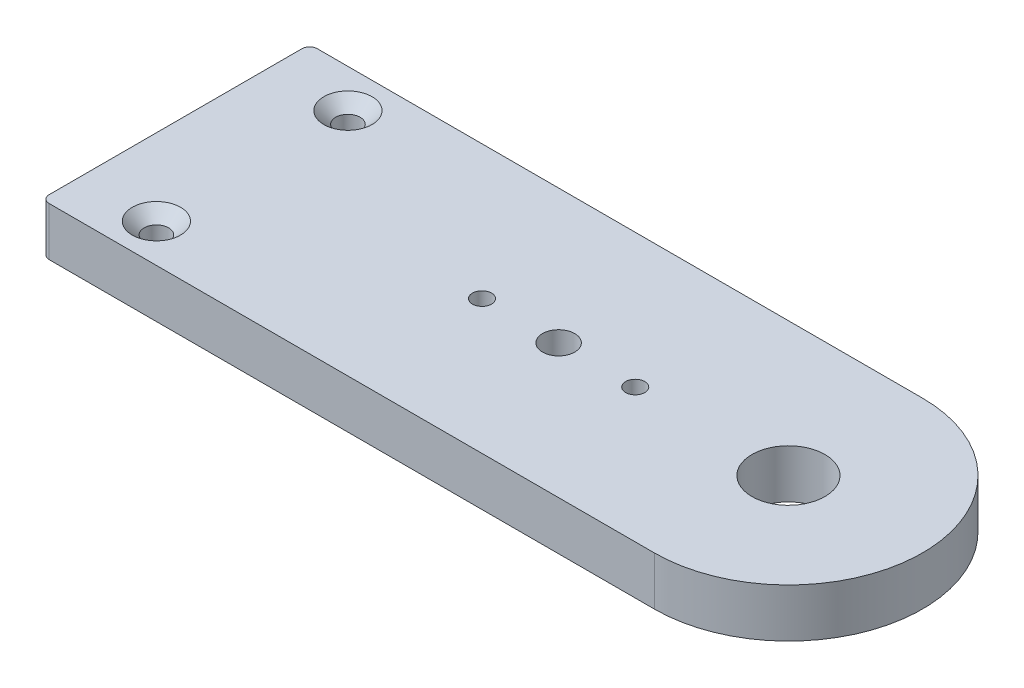
ISO-10303-21;
HEADER;
FILE_DESCRIPTION(('STEP AP214'),'2;1');
FILE_NAME('part.step','',(''),(''),'','','');
FILE_SCHEMA(('AUTOMOTIVE_DESIGN { 1 0 10303 214 1 1 1 1 }'));
ENDSEC;
DATA;
#1=APPLICATION_CONTEXT('core data for automotive mechanical design processes');
#2=APPLICATION_PROTOCOL_DEFINITION('international standard','automotive_design',2000,#1);
#3=PRODUCT_CONTEXT('',#1,'mechanical');
#4=PRODUCT('Part','Part','',(#3));
#5=PRODUCT_RELATED_PRODUCT_CATEGORY('part','',(#4));
#6=PRODUCT_DEFINITION_FORMATION('','',#4);
#7=PRODUCT_DEFINITION_CONTEXT('part definition',#1,'design');
#8=PRODUCT_DEFINITION('design','',#6,#7);
#9=PRODUCT_DEFINITION_SHAPE('','',#8);
#10=(LENGTH_UNIT() NAMED_UNIT(*) SI_UNIT(.MILLI.,.METRE.));
#11=(NAMED_UNIT(*) PLANE_ANGLE_UNIT() SI_UNIT($,.RADIAN.));
#12=(NAMED_UNIT(*) SI_UNIT($,.STERADIAN.) SOLID_ANGLE_UNIT());
#13=UNCERTAINTY_MEASURE_WITH_UNIT(LENGTH_MEASURE(1.E-05),#10,'distance_accuracy_value','');
#14=(GEOMETRIC_REPRESENTATION_CONTEXT(3) GLOBAL_UNCERTAINTY_ASSIGNED_CONTEXT((#13)) GLOBAL_UNIT_ASSIGNED_CONTEXT((#10,
#11,#12)) REPRESENTATION_CONTEXT('',''));
#15=CARTESIAN_POINT('',(0.,0.,0.));
#16=DIRECTION('',(0.,0.,1.));
#17=DIRECTION('',(1.,0.,0.));
#18=AXIS2_PLACEMENT_3D('',#15,#16,#17);
#19=CARTESIAN_POINT('',(70.,0.,0.));
#20=DIRECTION('',(0.,-1.,0.));
#21=DIRECTION('',(0.,0.,-1.));
#22=AXIS2_PLACEMENT_3D('',#19,#20,#21);
#23=PLANE('',#22);
#24=CARTESIAN_POINT('',(40.,0.,0.));
#25=DIRECTION('',(0.,1.,0.));
#26=DIRECTION('',(0.,0.,1.));
#27=AXIS2_PLACEMENT_3D('',#24,#25,#26);
#28=CIRCLE('',#27,2.09999999999999);
#29=CARTESIAN_POINT('',(40.,0.,2.09999999999999));
#30=VERTEX_POINT('',#29);
#31=EDGE_CURVE('E269',#30,#30,#28,.T.);
#32=ORIENTED_EDGE('',*,*,#31,.F.);
#33=EDGE_LOOP('',(#32));
#34=FACE_BOUND('',#33,.T.);
#35=CARTESIAN_POINT('',(30.,0.,0.));
#36=DIRECTION('',(0.,1.,0.));
#37=DIRECTION('',(0.,0.,1.));
#38=AXIS2_PLACEMENT_3D('',#35,#36,#37);
#39=CIRCLE('',#38,1.25);
#40=CARTESIAN_POINT('',(30.,0.,1.25));
#41=VERTEX_POINT('',#40);
#42=EDGE_CURVE('E263',#41,#41,#39,.T.);
#43=ORIENTED_EDGE('',*,*,#42,.F.);
#44=EDGE_LOOP('',(#43));
#45=FACE_BOUND('',#44,.T.);
#46=CARTESIAN_POINT('',(50.,0.,0.));
#47=DIRECTION('',(0.,1.,0.));
#48=DIRECTION('',(0.,0.,1.));
#49=AXIS2_PLACEMENT_3D('',#46,#47,#48);
#50=CIRCLE('',#49,1.25);
#51=CARTESIAN_POINT('',(50.,0.,1.25));
#52=VERTEX_POINT('',#51);
#53=EDGE_CURVE('E257',#52,#52,#50,.T.);
#54=ORIENTED_EDGE('',*,*,#53,.F.);
#55=EDGE_LOOP('',(#54));
#56=FACE_BOUND('',#55,.T.);
#57=CARTESIAN_POINT('',(70.,0.,0.));
#58=DIRECTION('',(0.,1.,0.));
#59=DIRECTION('',(0.,0.,1.));
#60=AXIS2_PLACEMENT_3D('',#57,#58,#59);
#61=CIRCLE('',#60,4.7625);
#62=CARTESIAN_POINT('',(70.,0.,4.7625));
#63=VERTEX_POINT('',#62);
#64=EDGE_CURVE('E230',#63,#63,#61,.T.);
#65=ORIENTED_EDGE('',*,*,#64,.F.);
#66=EDGE_LOOP('',(#65));
#67=FACE_BOUND('',#66,.T.);
#68=DIRECTION('',(-1.,0.,0.));
#69=VECTOR('',#68,1.);
#70=CARTESIAN_POINT('',(-10.,0.,-17.5));
#71=LINE('',#70,#69);
#72=CARTESIAN_POINT('',(70.,0.,-17.5));
#73=VERTEX_POINT('',#72);
#74=CARTESIAN_POINT('',(-9.,0.,-17.5));
#75=VERTEX_POINT('',#74);
#76=EDGE_CURVE('E128',#73,#75,#71,.T.);
#77=ORIENTED_EDGE('',*,*,#76,.T.);
#78=CARTESIAN_POINT('',(-9.,0.,-16.5));
#79=DIRECTION('',(0.,-1.,0.));
#80=DIRECTION('',(0.,0.,-1.));
#81=AXIS2_PLACEMENT_3D('',#78,#79,#80);
#82=CIRCLE('',#81,1.);
#83=CARTESIAN_POINT('',(-10.,0.,-16.5));
#84=VERTEX_POINT('',#83);
#85=EDGE_CURVE('E144',#75,#84,#82,.F.);
#86=ORIENTED_EDGE('',*,*,#85,.T.);
#87=DIRECTION('',(0.,0.,1.));
#88=VECTOR('',#87,1.);
#89=CARTESIAN_POINT('',(-10.,0.,-17.5));
#90=LINE('',#89,#88);
#91=CARTESIAN_POINT('',(-10.,0.,16.5));
#92=VERTEX_POINT('',#91);
#93=EDGE_CURVE('E99',#84,#92,#90,.T.);
#94=ORIENTED_EDGE('',*,*,#93,.T.);
#95=CARTESIAN_POINT('',(-9.,0.,16.5));
#96=DIRECTION('',(0.,-1.,0.));
#97=DIRECTION('',(0.,0.,-1.));
#98=AXIS2_PLACEMENT_3D('',#95,#96,#97);
#99=CIRCLE('',#98,1.);
#100=CARTESIAN_POINT('',(-9.,0.,17.5));
#101=VERTEX_POINT('',#100);
#102=EDGE_CURVE('E141',#92,#101,#99,.F.);
#103=ORIENTED_EDGE('',*,*,#102,.T.);
#104=DIRECTION('',(1.,0.,0.));
#105=VECTOR('',#104,1.);
#106=CARTESIAN_POINT('',(-10.,0.,17.5));
#107=LINE('',#106,#105);
#108=CARTESIAN_POINT('',(70.,0.,17.5));
#109=VERTEX_POINT('',#108);
#110=EDGE_CURVE('E122',#101,#109,#107,.T.);
#111=ORIENTED_EDGE('',*,*,#110,.T.);
#112=CARTESIAN_POINT('',(70.,0.,0.));
#113=DIRECTION('',(0.,1.,0.));
#114=DIRECTION('',(0.,0.,-1.));
#115=AXIS2_PLACEMENT_3D('',#112,#113,#114);
#116=CIRCLE('',#115,17.5);
#117=EDGE_CURVE('E105',#109,#73,#116,.T.);
#118=ORIENTED_EDGE('',*,*,#117,.T.);
#119=EDGE_LOOP('',(#77,#86,#94,#103,#111,#118));
#120=FACE_BOUND('',#119,.T.);
#121=CARTESIAN_POINT('',(0.,0.,12.5));
#122=DIRECTION('',(0.,1.,0.));
#123=DIRECTION('',(0.,0.,1.));
#124=AXIS2_PLACEMENT_3D('',#121,#122,#123);
#125=CIRCLE('',#124,3.15);
#126=CARTESIAN_POINT('',(0.,0.,15.65));
#127=VERTEX_POINT('',#126);
#128=EDGE_CURVE('E241',#127,#127,#125,.T.);
#129=ORIENTED_EDGE('',*,*,#128,.F.);
#130=EDGE_LOOP('',(#129));
#131=FACE_BOUND('',#130,.T.);
#132=CARTESIAN_POINT('',(0.,0.,-12.5));
#133=DIRECTION('',(0.,1.,0.));
#134=DIRECTION('',(0.,0.,1.));
#135=AXIS2_PLACEMENT_3D('',#132,#133,#134);
#136=CIRCLE('',#135,3.15);
#137=CARTESIAN_POINT('',(0.,0.,-9.35));
#138=VERTEX_POINT('',#137);
#139=EDGE_CURVE('E251',#138,#138,#136,.T.);
#140=ORIENTED_EDGE('',*,*,#139,.F.);
#141=EDGE_LOOP('',(#140));
#142=FACE_BOUND('',#141,.T.);
#143=ADVANCED_FACE('F39',(#34,#45,#56,#67,#120,#131,#142),#23,.F.);
#144=CARTESIAN_POINT('',(-10.,-6.35,17.5));
#145=DIRECTION('',(0.,0.,1.));
#146=DIRECTION('',(1.,0.,0.));
#147=AXIS2_PLACEMENT_3D('',#144,#145,#146);
#148=PLANE('',#147);
#149=ORIENTED_EDGE('',*,*,#110,.F.);
#150=DIRECTION('',(0.,1.,0.));
#151=VECTOR('',#150,1.);
#152=CARTESIAN_POINT('',(-9.,-6.35,17.5));
#153=LINE('',#152,#151);
#154=CARTESIAN_POINT('',(-9.,-6.35,17.5));
#155=VERTEX_POINT('',#154);
#156=EDGE_CURVE('E11',#101,#155,#153,.F.);
#157=ORIENTED_EDGE('',*,*,#156,.T.);
#158=DIRECTION('',(1.,0.,0.));
#159=VECTOR('',#158,1.);
#160=CARTESIAN_POINT('',(-10.,-6.35,17.5));
#161=LINE('',#160,#159);
#162=CARTESIAN_POINT('',(70.,-6.35,17.5));
#163=VERTEX_POINT('',#162);
#164=EDGE_CURVE('E91',#155,#163,#161,.T.);
#165=ORIENTED_EDGE('',*,*,#164,.T.);
#166=DIRECTION('',(0.,1.,0.));
#167=VECTOR('',#166,1.);
#168=CARTESIAN_POINT('',(70.,-6.35,17.5));
#169=LINE('',#168,#167);
#170=EDGE_CURVE('E94',#163,#109,#169,.T.);
#171=ORIENTED_EDGE('',*,*,#170,.T.);
#172=EDGE_LOOP('',(#149,#157,#165,#171));
#173=FACE_BOUND('',#172,.T.);
#174=ADVANCED_FACE('F93',(#173),#148,.T.);
#175=CARTESIAN_POINT('',(-10.,-6.35,-17.5));
#176=DIRECTION('',(-1.,0.,0.));
#177=DIRECTION('',(0.,0.,1.));
#178=AXIS2_PLACEMENT_3D('',#175,#176,#177);
#179=PLANE('',#178);
#180=ORIENTED_EDGE('',*,*,#93,.F.);
#181=DIRECTION('',(0.,1.,0.));
#182=VECTOR('',#181,1.);
#183=CARTESIAN_POINT('',(-10.,-6.35,-16.5));
#184=LINE('',#183,#182);
#185=CARTESIAN_POINT('',(-10.,-6.35,-16.5));
#186=VERTEX_POINT('',#185);
#187=EDGE_CURVE('E151',#84,#186,#184,.F.);
#188=ORIENTED_EDGE('',*,*,#187,.T.);
#189=DIRECTION('',(0.,0.,1.));
#190=VECTOR('',#189,1.);
#191=CARTESIAN_POINT('',(-10.,-6.35,-17.5));
#192=LINE('',#191,#190);
#193=CARTESIAN_POINT('',(-10.,-6.35,16.5));
#194=VERTEX_POINT('',#193);
#195=EDGE_CURVE('E108',#186,#194,#192,.T.);
#196=ORIENTED_EDGE('',*,*,#195,.T.);
#197=DIRECTION('',(0.,1.,0.));
#198=VECTOR('',#197,1.);
#199=CARTESIAN_POINT('',(-10.,-6.35,16.5));
#200=LINE('',#199,#198);
#201=EDGE_CURVE('E147',#194,#92,#200,.T.);
#202=ORIENTED_EDGE('',*,*,#201,.T.);
#203=EDGE_LOOP('',(#180,#188,#196,#202));
#204=FACE_BOUND('',#203,.T.);
#205=ADVANCED_FACE('F168',(#204),#179,.T.);
#206=CARTESIAN_POINT('',(-10.,-6.35,-17.5));
#207=DIRECTION('',(0.,0.,-1.));
#208=DIRECTION('',(-1.,0.,0.));
#209=AXIS2_PLACEMENT_3D('',#206,#207,#208);
#210=PLANE('',#209);
#211=DIRECTION('',(-1.,0.,0.));
#212=VECTOR('',#211,1.);
#213=CARTESIAN_POINT('',(-10.,-6.35,-17.5));
#214=LINE('',#213,#212);
#215=CARTESIAN_POINT('',(70.,-6.35,-17.5));
#216=VERTEX_POINT('',#215);
#217=CARTESIAN_POINT('',(-9.,-6.35,-17.5));
#218=VERTEX_POINT('',#217);
#219=EDGE_CURVE('E113',#216,#218,#214,.T.);
#220=ORIENTED_EDGE('',*,*,#219,.T.);
#221=DIRECTION('',(0.,1.,0.));
#222=VECTOR('',#221,1.);
#223=CARTESIAN_POINT('',(-9.,-6.35,-17.5));
#224=LINE('',#223,#222);
#225=EDGE_CURVE('E136',#218,#75,#224,.T.);
#226=ORIENTED_EDGE('',*,*,#225,.T.);
#227=ORIENTED_EDGE('',*,*,#76,.F.);
#228=DIRECTION('',(0.,1.,0.));
#229=VECTOR('',#228,1.);
#230=CARTESIAN_POINT('',(70.,-6.35,-17.5));
#231=LINE('',#230,#229);
#232=EDGE_CURVE('E107',#216,#73,#231,.T.);
#233=ORIENTED_EDGE('',*,*,#232,.F.);
#234=EDGE_LOOP('',(#220,#226,#227,#233));
#235=FACE_BOUND('',#234,.T.);
#236=ADVANCED_FACE('F161',(#235),#210,.T.);
#237=CARTESIAN_POINT('',(70.,-6.35,0.));
#238=DIRECTION('',(0.,1.,0.));
#239=DIRECTION('',(0.,0.,1.));
#240=AXIS2_PLACEMENT_3D('',#237,#238,#239);
#241=CYLINDRICAL_SURFACE('',#240,17.5);
#242=ORIENTED_EDGE('',*,*,#117,.F.);
#243=ORIENTED_EDGE('',*,*,#170,.F.);
#244=CARTESIAN_POINT('',(70.,-6.35,0.));
#245=DIRECTION('',(0.,1.,0.));
#246=DIRECTION('',(0.,0.,-1.));
#247=AXIS2_PLACEMENT_3D('',#244,#245,#246);
#248=CIRCLE('',#247,17.5);
#249=EDGE_CURVE('E98',#163,#216,#248,.T.);
#250=ORIENTED_EDGE('',*,*,#249,.T.);
#251=ORIENTED_EDGE('',*,*,#232,.T.);
#252=EDGE_LOOP('',(#242,#243,#250,#251));
#253=FACE_BOUND('',#252,.T.);
#254=ADVANCED_FACE('F103',(#253),#241,.T.);
#255=CARTESIAN_POINT('',(70.,-6.35,0.));
#256=DIRECTION('',(0.,-1.,0.));
#257=DIRECTION('',(0.,0.,-1.));
#258=AXIS2_PLACEMENT_3D('',#255,#256,#257);
#259=PLANE('',#258);
#260=CARTESIAN_POINT('',(40.,-6.35,0.));
#261=DIRECTION('',(0.,-1.,0.));
#262=DIRECTION('',(0.,0.,-1.));
#263=AXIS2_PLACEMENT_3D('',#260,#261,#262);
#264=CIRCLE('',#263,2.09999999999999);
#265=CARTESIAN_POINT('',(40.,-6.35,-2.09999999999999));
#266=VERTEX_POINT('',#265);
#267=EDGE_CURVE('E210',#266,#266,#264,.T.);
#268=ORIENTED_EDGE('',*,*,#267,.F.);
#269=EDGE_LOOP('',(#268));
#270=FACE_BOUND('',#269,.T.);
#271=CARTESIAN_POINT('',(30.,-6.35,0.));
#272=DIRECTION('',(0.,-1.,0.));
#273=DIRECTION('',(0.,0.,-1.));
#274=AXIS2_PLACEMENT_3D('',#271,#272,#273);
#275=CIRCLE('',#274,1.25);
#276=CARTESIAN_POINT('',(30.,-6.35,-1.25));
#277=VERTEX_POINT('',#276);
#278=EDGE_CURVE('E214',#277,#277,#275,.T.);
#279=ORIENTED_EDGE('',*,*,#278,.F.);
#280=EDGE_LOOP('',(#279));
#281=FACE_BOUND('',#280,.T.);
#282=CARTESIAN_POINT('',(50.,-6.35,0.));
#283=DIRECTION('',(0.,-1.,0.));
#284=DIRECTION('',(0.,0.,-1.));
#285=AXIS2_PLACEMENT_3D('',#282,#283,#284);
#286=CIRCLE('',#285,1.25);
#287=CARTESIAN_POINT('',(50.,-6.35,-1.25));
#288=VERTEX_POINT('',#287);
#289=EDGE_CURVE('E218',#288,#288,#286,.T.);
#290=ORIENTED_EDGE('',*,*,#289,.F.);
#291=EDGE_LOOP('',(#290));
#292=FACE_BOUND('',#291,.T.);
#293=CARTESIAN_POINT('',(0.,-6.35,-12.5));
#294=DIRECTION('',(0.,-1.,0.));
#295=DIRECTION('',(0.,0.,-1.));
#296=AXIS2_PLACEMENT_3D('',#293,#294,#295);
#297=CIRCLE('',#296,1.6);
#298=CARTESIAN_POINT('',(0.,-6.35,-14.1));
#299=VERTEX_POINT('',#298);
#300=EDGE_CURVE('E222',#299,#299,#297,.T.);
#301=ORIENTED_EDGE('',*,*,#300,.F.);
#302=EDGE_LOOP('',(#301));
#303=FACE_BOUND('',#302,.T.);
#304=CARTESIAN_POINT('',(0.,-6.35,12.5));
#305=DIRECTION('',(0.,-1.,0.));
#306=DIRECTION('',(0.,0.,-1.));
#307=AXIS2_PLACEMENT_3D('',#304,#305,#306);
#308=CIRCLE('',#307,1.6);
#309=CARTESIAN_POINT('',(0.,-6.35,10.9));
#310=VERTEX_POINT('',#309);
#311=EDGE_CURVE('E226',#310,#310,#308,.T.);
#312=ORIENTED_EDGE('',*,*,#311,.F.);
#313=EDGE_LOOP('',(#312));
#314=FACE_BOUND('',#313,.T.);
#315=CARTESIAN_POINT('',(70.,-6.35,0.));
#316=DIRECTION('',(0.,1.,0.));
#317=DIRECTION('',(0.,0.,1.));
#318=AXIS2_PLACEMENT_3D('',#315,#316,#317);
#319=CIRCLE('',#318,4.7625);
#320=CARTESIAN_POINT('',(70.,-6.35,4.7625));
#321=VERTEX_POINT('',#320);
#322=EDGE_CURVE('E125',#321,#321,#319,.T.);
#323=ORIENTED_EDGE('',*,*,#322,.T.);
#324=EDGE_LOOP('',(#323));
#325=FACE_BOUND('',#324,.T.);
#326=ORIENTED_EDGE('',*,*,#195,.F.);
#327=CARTESIAN_POINT('',(-9.,-6.35,-16.5));
#328=DIRECTION('',(0.,-1.,0.));
#329=DIRECTION('',(0.,0.,-1.));
#330=AXIS2_PLACEMENT_3D('',#327,#328,#329);
#331=CIRCLE('',#330,1.);
#332=EDGE_CURVE('E48',#186,#218,#331,.T.);
#333=ORIENTED_EDGE('',*,*,#332,.T.);
#334=ORIENTED_EDGE('',*,*,#219,.F.);
#335=ORIENTED_EDGE('',*,*,#249,.F.);
#336=ORIENTED_EDGE('',*,*,#164,.F.);
#337=CARTESIAN_POINT('',(-9.,-6.35,16.5));
#338=DIRECTION('',(0.,-1.,0.));
#339=DIRECTION('',(0.,0.,-1.));
#340=AXIS2_PLACEMENT_3D('',#337,#338,#339);
#341=CIRCLE('',#340,1.);
#342=EDGE_CURVE('E60',#155,#194,#341,.T.);
#343=ORIENTED_EDGE('',*,*,#342,.T.);
#344=EDGE_LOOP('',(#326,#333,#334,#335,#336,#343));
#345=FACE_BOUND('',#344,.T.);
#346=ADVANCED_FACE('F111',(#270,#281,#292,#303,#314,#325,#345),#259,.T.);
#347=CARTESIAN_POINT('',(70.,-6.35,0.));
#348=DIRECTION('',(0.,1.,0.));
#349=DIRECTION('',(0.,0.,1.));
#350=AXIS2_PLACEMENT_3D('',#347,#348,#349);
#351=CYLINDRICAL_SURFACE('',#350,4.7625);
#352=ORIENTED_EDGE('',*,*,#322,.F.);
#353=EDGE_LOOP('',(#352));
#354=FACE_BOUND('',#353,.T.);
#355=ORIENTED_EDGE('',*,*,#64,.T.);
#356=EDGE_LOOP('',(#355));
#357=FACE_BOUND('',#356,.T.);
#358=ADVANCED_FACE('F200',(#354,#357),#351,.F.);
#359=CARTESIAN_POINT('',(0.,0.,12.5));
#360=DIRECTION('',(0.,1.,0.));
#361=DIRECTION('',(0.,0.,1.));
#362=AXIS2_PLACEMENT_3D('',#359,#360,#361);
#363=CYLINDRICAL_SURFACE('',#362,1.6);
#364=CARTESIAN_POINT('',(0.,-1.55,12.5));
#365=DIRECTION('',(0.,1.,0.));
#366=DIRECTION('',(0.,0.,1.));
#367=AXIS2_PLACEMENT_3D('',#364,#365,#366);
#368=CIRCLE('',#367,1.6);
#369=CARTESIAN_POINT('',(0.,-1.55,14.1));
#370=VERTEX_POINT('',#369);
#371=EDGE_CURVE('E237',#370,#370,#368,.T.);
#372=ORIENTED_EDGE('',*,*,#371,.T.);
#373=EDGE_LOOP('',(#372));
#374=FACE_BOUND('',#373,.T.);
#375=ORIENTED_EDGE('',*,*,#311,.T.);
#376=EDGE_LOOP('',(#375));
#377=FACE_BOUND('',#376,.T.);
#378=ADVANCED_FACE('F205',(#374,#377),#363,.F.);
#379=CARTESIAN_POINT('',(0.,0.,12.5));
#380=DIRECTION('',(0.,1.,0.));
#381=DIRECTION('',(0.,0.,1.));
#382=AXIS2_PLACEMENT_3D('',#379,#380,#381);
#383=CONICAL_SURFACE('',#382,3.15,0.785398163397448);
#384=ORIENTED_EDGE('',*,*,#371,.F.);
#385=EDGE_LOOP('',(#384));
#386=FACE_BOUND('',#385,.T.);
#387=ORIENTED_EDGE('',*,*,#128,.T.);
#388=EDGE_LOOP('',(#387));
#389=FACE_BOUND('',#388,.T.);
#390=ADVANCED_FACE('F298',(#386,#389),#383,.F.);
#391=CARTESIAN_POINT('',(0.,0.,-12.5));
#392=DIRECTION('',(0.,1.,0.));
#393=DIRECTION('',(0.,0.,1.));
#394=AXIS2_PLACEMENT_3D('',#391,#392,#393);
#395=CYLINDRICAL_SURFACE('',#394,1.6);
#396=CARTESIAN_POINT('',(0.,-1.55,-12.5));
#397=DIRECTION('',(0.,1.,0.));
#398=DIRECTION('',(0.,0.,1.));
#399=AXIS2_PLACEMENT_3D('',#396,#397,#398);
#400=CIRCLE('',#399,1.6);
#401=CARTESIAN_POINT('',(0.,-1.55,-10.9));
#402=VERTEX_POINT('',#401);
#403=EDGE_CURVE('E247',#402,#402,#400,.T.);
#404=ORIENTED_EDGE('',*,*,#403,.T.);
#405=EDGE_LOOP('',(#404));
#406=FACE_BOUND('',#405,.T.);
#407=ORIENTED_EDGE('',*,*,#300,.T.);
#408=EDGE_LOOP('',(#407));
#409=FACE_BOUND('',#408,.T.);
#410=ADVANCED_FACE('F292',(#406,#409),#395,.F.);
#411=CARTESIAN_POINT('',(0.,0.,-12.5));
#412=DIRECTION('',(0.,1.,0.));
#413=DIRECTION('',(0.,0.,1.));
#414=AXIS2_PLACEMENT_3D('',#411,#412,#413);
#415=CONICAL_SURFACE('',#414,3.15,0.785398163397448);
#416=ORIENTED_EDGE('',*,*,#403,.F.);
#417=EDGE_LOOP('',(#416));
#418=FACE_BOUND('',#417,.T.);
#419=ORIENTED_EDGE('',*,*,#139,.T.);
#420=EDGE_LOOP('',(#419));
#421=FACE_BOUND('',#420,.T.);
#422=ADVANCED_FACE('F285',(#418,#421),#415,.F.);
#423=CARTESIAN_POINT('',(50.,0.,0.));
#424=DIRECTION('',(0.,1.,0.));
#425=DIRECTION('',(0.,0.,1.));
#426=AXIS2_PLACEMENT_3D('',#423,#424,#425);
#427=CYLINDRICAL_SURFACE('',#426,1.25);
#428=ORIENTED_EDGE('',*,*,#53,.T.);
#429=EDGE_LOOP('',(#428));
#430=FACE_BOUND('',#429,.T.);
#431=ORIENTED_EDGE('',*,*,#289,.T.);
#432=EDGE_LOOP('',(#431));
#433=FACE_BOUND('',#432,.T.);
#434=ADVANCED_FACE('F282',(#430,#433),#427,.F.);
#435=CARTESIAN_POINT('',(30.,0.,0.));
#436=DIRECTION('',(0.,1.,0.));
#437=DIRECTION('',(0.,0.,1.));
#438=AXIS2_PLACEMENT_3D('',#435,#436,#437);
#439=CYLINDRICAL_SURFACE('',#438,1.25);
#440=ORIENTED_EDGE('',*,*,#42,.T.);
#441=EDGE_LOOP('',(#440));
#442=FACE_BOUND('',#441,.T.);
#443=ORIENTED_EDGE('',*,*,#278,.T.);
#444=EDGE_LOOP('',(#443));
#445=FACE_BOUND('',#444,.T.);
#446=ADVANCED_FACE('F179',(#442,#445),#439,.F.);
#447=CARTESIAN_POINT('',(-9.,-6.35,-16.5));
#448=DIRECTION('',(0.,1.,0.));
#449=DIRECTION('',(0.,0.,1.));
#450=AXIS2_PLACEMENT_3D('',#447,#448,#449);
#451=CYLINDRICAL_SURFACE('',#450,1.);
#452=ORIENTED_EDGE('',*,*,#332,.F.);
#453=ORIENTED_EDGE('',*,*,#187,.F.);
#454=ORIENTED_EDGE('',*,*,#85,.F.);
#455=ORIENTED_EDGE('',*,*,#225,.F.);
#456=EDGE_LOOP('',(#452,#453,#454,#455));
#457=FACE_BOUND('',#456,.T.);
#458=ADVANCED_FACE('F163',(#457),#451,.T.);
#459=CARTESIAN_POINT('',(-9.,-6.35,16.5));
#460=DIRECTION('',(0.,1.,0.));
#461=DIRECTION('',(0.,0.,1.));
#462=AXIS2_PLACEMENT_3D('',#459,#460,#461);
#463=CYLINDRICAL_SURFACE('',#462,1.);
#464=ORIENTED_EDGE('',*,*,#342,.F.);
#465=ORIENTED_EDGE('',*,*,#156,.F.);
#466=ORIENTED_EDGE('',*,*,#102,.F.);
#467=ORIENTED_EDGE('',*,*,#201,.F.);
#468=EDGE_LOOP('',(#464,#465,#466,#467));
#469=FACE_BOUND('',#468,.T.);
#470=ADVANCED_FACE('F41',(#469),#463,.T.);
#471=CARTESIAN_POINT('',(40.,0.,0.));
#472=DIRECTION('',(0.,1.,0.));
#473=DIRECTION('',(0.,0.,1.));
#474=AXIS2_PLACEMENT_3D('',#471,#472,#473);
#475=CYLINDRICAL_SURFACE('',#474,2.09999999999999);
#476=ORIENTED_EDGE('',*,*,#31,.T.);
#477=EDGE_LOOP('',(#476));
#478=FACE_BOUND('',#477,.T.);
#479=ORIENTED_EDGE('',*,*,#267,.T.);
#480=EDGE_LOOP('',(#479));
#481=FACE_BOUND('',#480,.T.);
#482=ADVANCED_FACE('F172',(#478,#481),#475,.F.);
#483=CLOSED_SHELL('',(#143,#174,#205,#236,#254,#346,#358,#378,#390,#410,#422,#434,#446,#458,
#470,#482));
#484=MANIFOLD_SOLID_BREP('B2',#483);
#485=ADVANCED_BREP_SHAPE_REPRESENTATION('',(#18,#484),#14);
#486=SHAPE_DEFINITION_REPRESENTATION(#9,#485);
ENDSEC;
END-ISO-10303-21;
